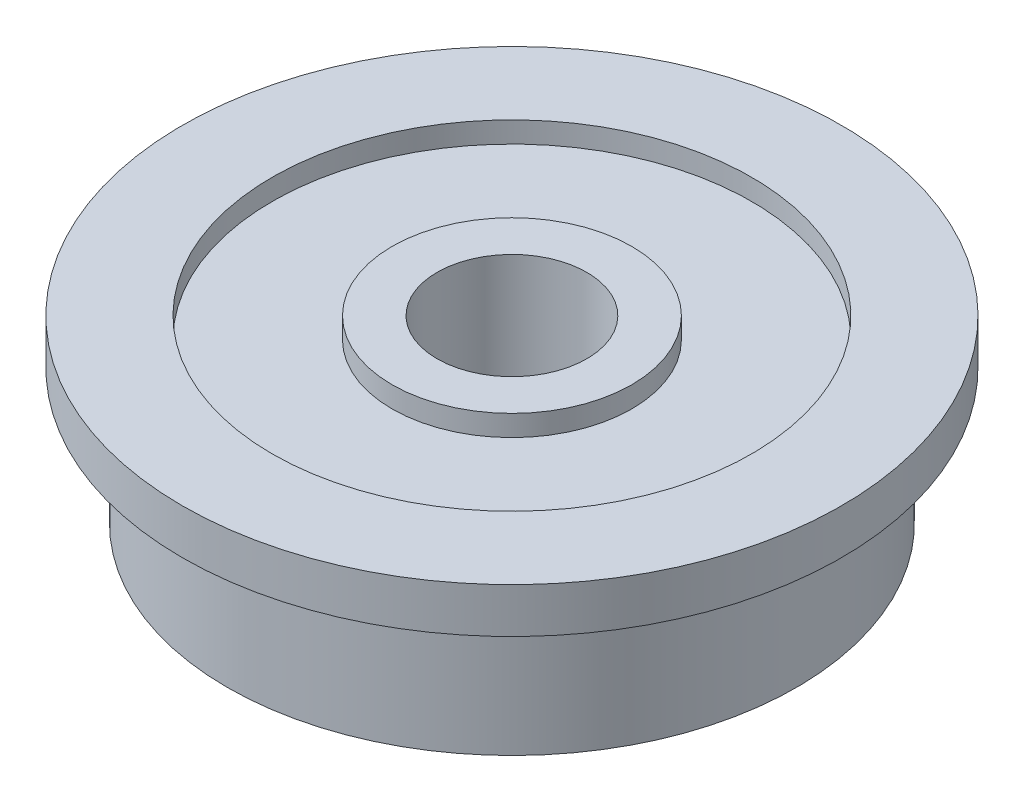
ISO-10303-21;
HEADER;
FILE_DESCRIPTION(('STEP AP214'),'2;1');
FILE_NAME('part.step','',(''),(''),'','','');
FILE_SCHEMA(('AUTOMOTIVE_DESIGN { 1 0 10303 214 1 1 1 1 }'));
ENDSEC;
DATA;
#1=APPLICATION_CONTEXT('core data for automotive mechanical design processes');
#2=APPLICATION_PROTOCOL_DEFINITION('international standard','automotive_design',2000,#1);
#3=PRODUCT_CONTEXT('',#1,'mechanical');
#4=PRODUCT('Part','Part','',(#3));
#5=PRODUCT_RELATED_PRODUCT_CATEGORY('part','',(#4));
#6=PRODUCT_DEFINITION_FORMATION('','',#4);
#7=PRODUCT_DEFINITION_CONTEXT('part definition',#1,'design');
#8=PRODUCT_DEFINITION('design','',#6,#7);
#9=PRODUCT_DEFINITION_SHAPE('','',#8);
#10=(LENGTH_UNIT() NAMED_UNIT(*) SI_UNIT(.MILLI.,.METRE.));
#11=(NAMED_UNIT(*) PLANE_ANGLE_UNIT() SI_UNIT($,.RADIAN.));
#12=(NAMED_UNIT(*) SI_UNIT($,.STERADIAN.) SOLID_ANGLE_UNIT());
#13=UNCERTAINTY_MEASURE_WITH_UNIT(LENGTH_MEASURE(1.E-05),#10,'distance_accuracy_value','');
#14=(GEOMETRIC_REPRESENTATION_CONTEXT(3) GLOBAL_UNCERTAINTY_ASSIGNED_CONTEXT((#13)) GLOBAL_UNIT_ASSIGNED_CONTEXT((#10,
#11,#12)) REPRESENTATION_CONTEXT('',''));
#15=CARTESIAN_POINT('',(0.,0.,0.));
#16=DIRECTION('',(0.,0.,1.));
#17=DIRECTION('',(1.,0.,0.));
#18=AXIS2_PLACEMENT_3D('',#15,#16,#17);
#19=CARTESIAN_POINT('',(0.,4.61129603751149,0.));
#20=DIRECTION('',(0.,1.,0.));
#21=DIRECTION('',(0.,0.,1.));
#22=AXIS2_PLACEMENT_3D('',#19,#20,#21);
#23=CYLINDRICAL_SURFACE('',#22,9.5);
#24=CARTESIAN_POINT('',(0.,0.,0.));
#25=DIRECTION('',(0.,1.,0.));
#26=DIRECTION('',(0.,0.,1.));
#27=AXIS2_PLACEMENT_3D('',#24,#25,#26);
#28=CIRCLE('',#27,9.5);
#29=CARTESIAN_POINT('',(0.,0.,9.5));
#30=VERTEX_POINT('',#29);
#31=EDGE_CURVE('E68',#30,#30,#28,.T.);
#32=ORIENTED_EDGE('',*,*,#31,.T.);
#33=EDGE_LOOP('',(#32));
#34=FACE_BOUND('',#33,.T.);
#35=CARTESIAN_POINT('',(0.,4.5,0.));
#36=DIRECTION('',(0.,1.,0.));
#37=DIRECTION('',(0.,0.,1.));
#38=AXIS2_PLACEMENT_3D('',#35,#36,#37);
#39=CIRCLE('',#38,9.5);
#40=CARTESIAN_POINT('',(0.,4.5,9.5));
#41=VERTEX_POINT('',#40);
#42=EDGE_CURVE('E10',#41,#41,#39,.T.);
#43=ORIENTED_EDGE('',*,*,#42,.F.);
#44=EDGE_LOOP('',(#43));
#45=FACE_BOUND('',#44,.T.);
#46=ADVANCED_FACE('F39',(#34,#45),#23,.T.);
#47=CARTESIAN_POINT('',(4.,6.,0.));
#48=DIRECTION('',(0.,-1.,0.));
#49=DIRECTION('',(0.,0.,-1.));
#50=AXIS2_PLACEMENT_3D('',#47,#48,#49);
#51=PLANE('',#50);
#52=CARTESIAN_POINT('',(0.,6.,0.));
#53=DIRECTION('',(0.,1.,0.));
#54=DIRECTION('',(0.,0.,1.));
#55=AXIS2_PLACEMENT_3D('',#52,#53,#54);
#56=CIRCLE('',#55,2.5);
#57=CARTESIAN_POINT('',(0.,6.,2.5));
#58=VERTEX_POINT('',#57);
#59=EDGE_CURVE('E46',#58,#58,#56,.T.);
#60=ORIENTED_EDGE('',*,*,#59,.F.);
#61=EDGE_LOOP('',(#60));
#62=FACE_BOUND('',#61,.T.);
#63=CARTESIAN_POINT('',(0.,6.,0.));
#64=DIRECTION('',(0.,1.,0.));
#65=DIRECTION('',(0.,0.,1.));
#66=AXIS2_PLACEMENT_3D('',#63,#64,#65);
#67=CIRCLE('',#66,4.);
#68=CARTESIAN_POINT('',(0.,6.,4.));
#69=VERTEX_POINT('',#68);
#70=EDGE_CURVE('E80',#69,#69,#67,.T.);
#71=ORIENTED_EDGE('',*,*,#70,.T.);
#72=EDGE_LOOP('',(#71));
#73=FACE_BOUND('',#72,.T.);
#74=ADVANCED_FACE('F41',(#62,#73),#51,.F.);
#75=CARTESIAN_POINT('',(0.,4.61129603751149,0.));
#76=DIRECTION('',(0.,1.,0.));
#77=DIRECTION('',(0.,0.,1.));
#78=AXIS2_PLACEMENT_3D('',#75,#76,#77);
#79=CYLINDRICAL_SURFACE('',#78,2.5);
#80=CARTESIAN_POINT('',(0.,0.,0.));
#81=DIRECTION('',(0.,1.,0.));
#82=DIRECTION('',(0.,0.,1.));
#83=AXIS2_PLACEMENT_3D('',#80,#81,#82);
#84=CIRCLE('',#83,2.5);
#85=CARTESIAN_POINT('',(0.,0.,2.5));
#86=VERTEX_POINT('',#85);
#87=EDGE_CURVE('E50',#86,#86,#84,.T.);
#88=ORIENTED_EDGE('',*,*,#87,.F.);
#89=EDGE_LOOP('',(#88));
#90=FACE_BOUND('',#89,.T.);
#91=ORIENTED_EDGE('',*,*,#59,.T.);
#92=EDGE_LOOP('',(#91));
#93=FACE_BOUND('',#92,.T.);
#94=ADVANCED_FACE('F107',(#90,#93),#79,.F.);
#95=CARTESIAN_POINT('',(2.5,0.,0.));
#96=DIRECTION('',(0.,1.,0.));
#97=DIRECTION('',(0.,0.,1.));
#98=AXIS2_PLACEMENT_3D('',#95,#96,#97);
#99=PLANE('',#98);
#100=CARTESIAN_POINT('',(0.,0.,0.));
#101=DIRECTION('',(0.,1.,0.));
#102=DIRECTION('',(0.,0.,1.));
#103=AXIS2_PLACEMENT_3D('',#100,#101,#102);
#104=CIRCLE('',#103,4.);
#105=CARTESIAN_POINT('',(0.,0.,4.));
#106=VERTEX_POINT('',#105);
#107=EDGE_CURVE('E54',#106,#106,#104,.T.);
#108=ORIENTED_EDGE('',*,*,#107,.F.);
#109=EDGE_LOOP('',(#108));
#110=FACE_BOUND('',#109,.T.);
#111=ORIENTED_EDGE('',*,*,#87,.T.);
#112=EDGE_LOOP('',(#111));
#113=FACE_BOUND('',#112,.T.);
#114=ADVANCED_FACE('F129',(#110,#113),#99,.F.);
#115=CARTESIAN_POINT('',(0.,4.61129603751149,0.));
#116=DIRECTION('',(0.,1.,0.));
#117=DIRECTION('',(0.,0.,1.));
#118=AXIS2_PLACEMENT_3D('',#115,#116,#117);
#119=CYLINDRICAL_SURFACE('',#118,4.);
#120=CARTESIAN_POINT('',(0.,0.7,0.));
#121=DIRECTION('',(0.,1.,0.));
#122=DIRECTION('',(0.,0.,1.));
#123=AXIS2_PLACEMENT_3D('',#120,#121,#122);
#124=CIRCLE('',#123,4.);
#125=CARTESIAN_POINT('',(0.,0.7,4.));
#126=VERTEX_POINT('',#125);
#127=EDGE_CURVE('E59',#126,#126,#124,.T.);
#128=ORIENTED_EDGE('',*,*,#127,.F.);
#129=EDGE_LOOP('',(#128));
#130=FACE_BOUND('',#129,.T.);
#131=ORIENTED_EDGE('',*,*,#107,.T.);
#132=EDGE_LOOP('',(#131));
#133=FACE_BOUND('',#132,.T.);
#134=ADVANCED_FACE('F125',(#130,#133),#119,.T.);
#135=CARTESIAN_POINT('',(4.,0.7,0.));
#136=DIRECTION('',(0.,1.,0.));
#137=DIRECTION('',(0.,0.,1.));
#138=AXIS2_PLACEMENT_3D('',#135,#136,#137);
#139=PLANE('',#138);
#140=CARTESIAN_POINT('',(0.,0.7,0.));
#141=DIRECTION('',(0.,1.,0.));
#142=DIRECTION('',(0.,0.,1.));
#143=AXIS2_PLACEMENT_3D('',#140,#141,#142);
#144=CIRCLE('',#143,8.);
#145=CARTESIAN_POINT('',(0.,0.7,8.));
#146=VERTEX_POINT('',#145);
#147=EDGE_CURVE('E62',#146,#146,#144,.T.);
#148=ORIENTED_EDGE('',*,*,#147,.F.);
#149=EDGE_LOOP('',(#148));
#150=FACE_BOUND('',#149,.T.);
#151=ORIENTED_EDGE('',*,*,#127,.T.);
#152=EDGE_LOOP('',(#151));
#153=FACE_BOUND('',#152,.T.);
#154=ADVANCED_FACE('F121',(#150,#153),#139,.F.);
#155=CARTESIAN_POINT('',(0.,4.61129603751149,0.));
#156=DIRECTION('',(0.,1.,0.));
#157=DIRECTION('',(0.,0.,1.));
#158=AXIS2_PLACEMENT_3D('',#155,#156,#157);
#159=CYLINDRICAL_SURFACE('',#158,8.);
#160=CARTESIAN_POINT('',(0.,0.,0.));
#161=DIRECTION('',(0.,1.,0.));
#162=DIRECTION('',(0.,0.,1.));
#163=AXIS2_PLACEMENT_3D('',#160,#161,#162);
#164=CIRCLE('',#163,8.);
#165=CARTESIAN_POINT('',(0.,0.,8.));
#166=VERTEX_POINT('',#165);
#167=EDGE_CURVE('E65',#166,#166,#164,.T.);
#168=ORIENTED_EDGE('',*,*,#167,.F.);
#169=EDGE_LOOP('',(#168));
#170=FACE_BOUND('',#169,.T.);
#171=ORIENTED_EDGE('',*,*,#147,.T.);
#172=EDGE_LOOP('',(#171));
#173=FACE_BOUND('',#172,.T.);
#174=ADVANCED_FACE('F117',(#170,#173),#159,.F.);
#175=CARTESIAN_POINT('',(8.,0.,0.));
#176=DIRECTION('',(0.,1.,0.));
#177=DIRECTION('',(0.,0.,1.));
#178=AXIS2_PLACEMENT_3D('',#175,#176,#177);
#179=PLANE('',#178);
#180=ORIENTED_EDGE('',*,*,#31,.F.);
#181=EDGE_LOOP('',(#180));
#182=FACE_BOUND('',#181,.T.);
#183=ORIENTED_EDGE('',*,*,#167,.T.);
#184=EDGE_LOOP('',(#183));
#185=FACE_BOUND('',#184,.T.);
#186=ADVANCED_FACE('F114',(#182,#185),#179,.F.);
#187=CARTESIAN_POINT('',(9.5,6.,0.));
#188=DIRECTION('',(0.,-1.,0.));
#189=DIRECTION('',(0.,0.,-1.));
#190=AXIS2_PLACEMENT_3D('',#187,#188,#189);
#191=PLANE('',#190);
#192=CARTESIAN_POINT('',(0.,6.,0.));
#193=DIRECTION('',(0.,1.,0.));
#194=DIRECTION('',(0.,0.,1.));
#195=AXIS2_PLACEMENT_3D('',#192,#193,#194);
#196=CIRCLE('',#195,8.);
#197=CARTESIAN_POINT('',(0.,6.,8.));
#198=VERTEX_POINT('',#197);
#199=EDGE_CURVE('E71',#198,#198,#196,.T.);
#200=ORIENTED_EDGE('',*,*,#199,.F.);
#201=EDGE_LOOP('',(#200));
#202=FACE_BOUND('',#201,.T.);
#203=CARTESIAN_POINT('',(0.,6.,0.));
#204=DIRECTION('',(0.,1.,0.));
#205=DIRECTION('',(0.,0.,1.));
#206=AXIS2_PLACEMENT_3D('',#203,#204,#205);
#207=CIRCLE('',#206,11.);
#208=CARTESIAN_POINT('',(0.,6.,11.));
#209=VERTEX_POINT('',#208);
#210=EDGE_CURVE('E84',#209,#209,#207,.T.);
#211=ORIENTED_EDGE('',*,*,#210,.T.);
#212=EDGE_LOOP('',(#211));
#213=FACE_BOUND('',#212,.T.);
#214=ADVANCED_FACE('F112',(#202,#213),#191,.F.);
#215=CARTESIAN_POINT('',(0.,4.61129603751149,0.));
#216=DIRECTION('',(0.,1.,0.));
#217=DIRECTION('',(0.,0.,1.));
#218=AXIS2_PLACEMENT_3D('',#215,#216,#217);
#219=CYLINDRICAL_SURFACE('',#218,8.);
#220=CARTESIAN_POINT('',(0.,5.3,0.));
#221=DIRECTION('',(0.,1.,0.));
#222=DIRECTION('',(0.,0.,1.));
#223=AXIS2_PLACEMENT_3D('',#220,#221,#222);
#224=CIRCLE('',#223,8.);
#225=CARTESIAN_POINT('',(0.,5.3,8.));
#226=VERTEX_POINT('',#225);
#227=EDGE_CURVE('E74',#226,#226,#224,.T.);
#228=ORIENTED_EDGE('',*,*,#227,.F.);
#229=EDGE_LOOP('',(#228));
#230=FACE_BOUND('',#229,.T.);
#231=ORIENTED_EDGE('',*,*,#199,.T.);
#232=EDGE_LOOP('',(#231));
#233=FACE_BOUND('',#232,.T.);
#234=ADVANCED_FACE('F169',(#230,#233),#219,.F.);
#235=CARTESIAN_POINT('',(8.,5.3,0.));
#236=DIRECTION('',(0.,-1.,0.));
#237=DIRECTION('',(0.,0.,-1.));
#238=AXIS2_PLACEMENT_3D('',#235,#236,#237);
#239=PLANE('',#238);
#240=CARTESIAN_POINT('',(0.,5.3,0.));
#241=DIRECTION('',(0.,1.,0.));
#242=DIRECTION('',(0.,0.,1.));
#243=AXIS2_PLACEMENT_3D('',#240,#241,#242);
#244=CIRCLE('',#243,4.);
#245=CARTESIAN_POINT('',(0.,5.3,4.));
#246=VERTEX_POINT('',#245);
#247=EDGE_CURVE('E77',#246,#246,#244,.T.);
#248=ORIENTED_EDGE('',*,*,#247,.F.);
#249=EDGE_LOOP('',(#248));
#250=FACE_BOUND('',#249,.T.);
#251=ORIENTED_EDGE('',*,*,#227,.T.);
#252=EDGE_LOOP('',(#251));
#253=FACE_BOUND('',#252,.T.);
#254=ADVANCED_FACE('F176',(#250,#253),#239,.F.);
#255=CARTESIAN_POINT('',(0.,4.61129603751149,0.));
#256=DIRECTION('',(0.,1.,0.));
#257=DIRECTION('',(0.,0.,1.));
#258=AXIS2_PLACEMENT_3D('',#255,#256,#257);
#259=CYLINDRICAL_SURFACE('',#258,4.);
#260=ORIENTED_EDGE('',*,*,#70,.F.);
#261=EDGE_LOOP('',(#260));
#262=FACE_BOUND('',#261,.T.);
#263=ORIENTED_EDGE('',*,*,#247,.T.);
#264=EDGE_LOOP('',(#263));
#265=FACE_BOUND('',#264,.T.);
#266=ADVANCED_FACE('F99',(#262,#265),#259,.T.);
#267=CARTESIAN_POINT('',(0.,4.5,0.));
#268=DIRECTION('',(0.,1.,0.));
#269=DIRECTION('',(0.,0.,1.));
#270=AXIS2_PLACEMENT_3D('',#267,#268,#269);
#271=CYLINDRICAL_SURFACE('',#270,11.);
#272=CARTESIAN_POINT('',(0.,4.5,0.));
#273=DIRECTION('',(0.,1.,0.));
#274=DIRECTION('',(0.,0.,1.));
#275=AXIS2_PLACEMENT_3D('',#272,#273,#274);
#276=CIRCLE('',#275,11.);
#277=CARTESIAN_POINT('',(0.,4.5,11.));
#278=VERTEX_POINT('',#277);
#279=EDGE_CURVE('E83',#278,#278,#276,.T.);
#280=ORIENTED_EDGE('',*,*,#279,.T.);
#281=EDGE_LOOP('',(#280));
#282=FACE_BOUND('',#281,.T.);
#283=ORIENTED_EDGE('',*,*,#210,.F.);
#284=EDGE_LOOP('',(#283));
#285=FACE_BOUND('',#284,.T.);
#286=ADVANCED_FACE('F90',(#282,#285),#271,.T.);
#287=CARTESIAN_POINT('',(0.,4.5,0.));
#288=DIRECTION('',(0.,1.,0.));
#289=DIRECTION('',(0.,0.,1.));
#290=AXIS2_PLACEMENT_3D('',#287,#288,#289);
#291=PLANE('',#290);
#292=ORIENTED_EDGE('',*,*,#42,.T.);
#293=EDGE_LOOP('',(#292));
#294=FACE_BOUND('',#293,.T.);
#295=ORIENTED_EDGE('',*,*,#279,.F.);
#296=EDGE_LOOP('',(#295));
#297=FACE_BOUND('',#296,.T.);
#298=ADVANCED_FACE('F93',(#294,#297),#291,.F.);
#299=CLOSED_SHELL('',(#46,#74,#94,#114,#134,#154,#174,#186,#214,#234,#254,#266,#286,#298));
#300=MANIFOLD_SOLID_BREP('B2',#299);
#301=ADVANCED_BREP_SHAPE_REPRESENTATION('',(#18,#300),#14);
#302=SHAPE_DEFINITION_REPRESENTATION(#9,#301);
ENDSEC;
END-ISO-10303-21;
